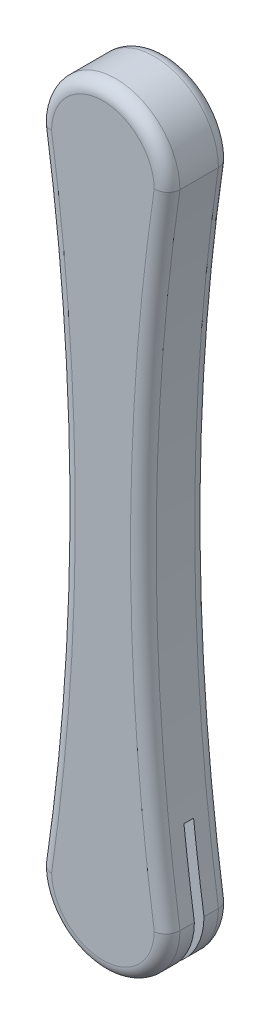
ISO-10303-21;
HEADER;
FILE_DESCRIPTION(('STEP AP214'),'2;1');
FILE_NAME('part.step','',(''),(''),'','','');
FILE_SCHEMA(('AUTOMOTIVE_DESIGN { 1 0 10303 214 1 1 1 1 }'));
ENDSEC;
DATA;
#1=APPLICATION_CONTEXT('core data for automotive mechanical design processes');
#2=APPLICATION_PROTOCOL_DEFINITION('international standard','automotive_design',2000,#1);
#3=PRODUCT_CONTEXT('',#1,'mechanical');
#4=PRODUCT('Part','Part','',(#3));
#5=PRODUCT_RELATED_PRODUCT_CATEGORY('part','',(#4));
#6=PRODUCT_DEFINITION_FORMATION('','',#4);
#7=PRODUCT_DEFINITION_CONTEXT('part definition',#1,'design');
#8=PRODUCT_DEFINITION('design','',#6,#7);
#9=PRODUCT_DEFINITION_SHAPE('','',#8);
#10=(LENGTH_UNIT() NAMED_UNIT(*) SI_UNIT(.MILLI.,.METRE.));
#11=(NAMED_UNIT(*) PLANE_ANGLE_UNIT() SI_UNIT($,.RADIAN.));
#12=(NAMED_UNIT(*) SI_UNIT($,.STERADIAN.) SOLID_ANGLE_UNIT());
#13=UNCERTAINTY_MEASURE_WITH_UNIT(LENGTH_MEASURE(1.E-05),#10,'distance_accuracy_value','');
#14=(GEOMETRIC_REPRESENTATION_CONTEXT(3) GLOBAL_UNCERTAINTY_ASSIGNED_CONTEXT((#13)) GLOBAL_UNIT_ASSIGNED_CONTEXT((#10,
#11,#12)) REPRESENTATION_CONTEXT('',''));
#15=CARTESIAN_POINT('',(0.,0.,0.));
#16=DIRECTION('',(0.,0.,1.));
#17=DIRECTION('',(1.,0.,0.));
#18=AXIS2_PLACEMENT_3D('',#15,#16,#17);
#19=CARTESIAN_POINT('',(0.,-200.,20.));
#20=DIRECTION('',(0.,0.,-1.));
#21=DIRECTION('',(-1.,0.,0.));
#22=AXIS2_PLACEMENT_3D('',#19,#20,#21);
#23=CYLINDRICAL_SURFACE('',#22,20.);
#24=DIRECTION('',(0.,0.,-1.));
#25=VECTOR('',#24,1.);
#26=CARTESIAN_POINT('',(-19.9984345020432,-200.250234824694,20.));
#27=LINE('',#26,#25);
#28=CARTESIAN_POINT('',(-19.9984345020432,-200.250234824694,16.));
#29=VERTEX_POINT('',#28);
#30=CARTESIAN_POINT('',(-19.9984345020431,-200.250234824694,11.5));
#31=VERTEX_POINT('',#30);
#32=EDGE_CURVE('E163',#29,#31,#27,.T.);
#33=ORIENTED_EDGE('',*,*,#32,.T.);
#34=CARTESIAN_POINT('',(0.,-200.,11.5));
#35=DIRECTION('',(0.,0.,1.));
#36=DIRECTION('',(1.,0.,0.));
#37=AXIS2_PLACEMENT_3D('',#34,#35,#36);
#38=CIRCLE('',#37,20.);
#39=CARTESIAN_POINT('',(20.,-200.,11.5));
#40=VERTEX_POINT('',#39);
#41=EDGE_CURVE('E49',#31,#40,#38,.T.);
#42=ORIENTED_EDGE('',*,*,#41,.T.);
#43=DIRECTION('',(0.,0.,-1.));
#44=VECTOR('',#43,1.);
#45=CARTESIAN_POINT('',(20.,-200.,20.));
#46=LINE('',#45,#44);
#47=CARTESIAN_POINT('',(20.,-200.,16.));
#48=VERTEX_POINT('',#47);
#49=EDGE_CURVE('E159',#48,#40,#46,.T.);
#50=ORIENTED_EDGE('',*,*,#49,.F.);
#51=CARTESIAN_POINT('',(0.,-200.,16.));
#52=DIRECTION('',(0.,0.,-1.));
#53=DIRECTION('',(-1.,0.,0.));
#54=AXIS2_PLACEMENT_3D('',#51,#52,#53);
#55=CIRCLE('',#54,20.);
#56=EDGE_CURVE('E187',#48,#29,#55,.T.);
#57=ORIENTED_EDGE('',*,*,#56,.T.);
#58=EDGE_LOOP('',(#33,#42,#50,#57));
#59=FACE_BOUND('',#58,.T.);
#60=ADVANCED_FACE('F39',(#59),#23,.T.);
#61=CARTESIAN_POINT('',(692.606868832009,-99.9999999999999,20.));
#62=DIRECTION('',(0.,0.,-1.));
#63=DIRECTION('',(-1.,0.,0.));
#64=AXIS2_PLACEMENT_3D('',#61,#62,#63);
#65=CYLINDRICAL_SURFACE('',#64,680.);
#66=ORIENTED_EDGE('',*,*,#49,.T.);
#67=CARTESIAN_POINT('',(692.606868832009,-99.9999999999999,11.5));
#68=DIRECTION('',(0.,0.,1.));
#69=DIRECTION('',(1.,0.,0.));
#70=AXIS2_PLACEMENT_3D('',#67,#68,#69);
#71=CIRCLE('',#70,680.);
#72=CARTESIAN_POINT('',(16.7555538225615,-175.,11.5));
#73=VERTEX_POINT('',#72);
#74=EDGE_CURVE('E154',#40,#73,#71,.F.);
#75=ORIENTED_EDGE('',*,*,#74,.T.);
#76=DIRECTION('',(0.,0.,-1.));
#77=VECTOR('',#76,1.);
#78=CARTESIAN_POINT('',(16.7555538225616,-175.,20.));
#79=LINE('',#78,#77);
#80=CARTESIAN_POINT('',(16.7555538225616,-175.,8.5));
#81=VERTEX_POINT('',#80);
#82=EDGE_CURVE('E157',#73,#81,#79,.T.);
#83=ORIENTED_EDGE('',*,*,#82,.T.);
#84=CARTESIAN_POINT('',(692.606868832009,-99.9999999999999,8.5));
#85=DIRECTION('',(0.,0.,-1.));
#86=DIRECTION('',(0.,1.,0.));
#87=AXIS2_PLACEMENT_3D('',#84,#85,#86);
#88=CIRCLE('',#87,680.);
#89=CARTESIAN_POINT('',(20.,-200.,8.5));
#90=VERTEX_POINT('',#89);
#91=EDGE_CURVE('E142',#81,#90,#88,.F.);
#92=ORIENTED_EDGE('',*,*,#91,.T.);
#93=CARTESIAN_POINT('',(20.,-200.,4.));
#94=VERTEX_POINT('',#93);
#95=EDGE_CURVE('E162',#90,#94,#46,.T.);
#96=ORIENTED_EDGE('',*,*,#95,.T.);
#97=CARTESIAN_POINT('',(692.606868832009,-99.9999999999999,4.));
#98=DIRECTION('',(0.,0.,-1.));
#99=DIRECTION('',(-1.,0.,0.));
#100=AXIS2_PLACEMENT_3D('',#97,#98,#99);
#101=CIRCLE('',#100,680.);
#102=CARTESIAN_POINT('',(20.,0.,4.));
#103=VERTEX_POINT('',#102);
#104=EDGE_CURVE('E198',#94,#103,#101,.T.);
#105=ORIENTED_EDGE('',*,*,#104,.T.);
#106=DIRECTION('',(0.,0.,-1.));
#107=VECTOR('',#106,1.);
#108=CARTESIAN_POINT('',(20.,0.,20.));
#109=LINE('',#108,#107);
#110=CARTESIAN_POINT('',(20.,0.,16.));
#111=VERTEX_POINT('',#110);
#112=EDGE_CURVE('E169',#111,#103,#109,.T.);
#113=ORIENTED_EDGE('',*,*,#112,.F.);
#114=CARTESIAN_POINT('',(692.606868832009,-99.9999999999999,16.));
#115=DIRECTION('',(0.,0.,-1.));
#116=DIRECTION('',(-1.,0.,0.));
#117=AXIS2_PLACEMENT_3D('',#114,#115,#116);
#118=CIRCLE('',#117,680.);
#119=EDGE_CURVE('E196',#111,#48,#118,.F.);
#120=ORIENTED_EDGE('',*,*,#119,.T.);
#121=EDGE_LOOP('',(#66,#75,#83,#92,#96,#105,#113,#120));
#122=FACE_BOUND('',#121,.T.);
#123=ADVANCED_FACE('F298',(#122),#65,.F.);
#124=CARTESIAN_POINT('',(0.,0.,20.));
#125=DIRECTION('',(0.,0.,-1.));
#126=DIRECTION('',(-1.,0.,0.));
#127=AXIS2_PLACEMENT_3D('',#124,#125,#126);
#128=CYLINDRICAL_SURFACE('',#127,20.);
#129=ORIENTED_EDGE('',*,*,#112,.T.);
#130=CARTESIAN_POINT('',(0.,0.,4.));
#131=DIRECTION('',(0.,0.,-1.));
#132=DIRECTION('',(-1.,0.,0.));
#133=AXIS2_PLACEMENT_3D('',#130,#131,#132);
#134=CIRCLE('',#133,20.);
#135=CARTESIAN_POINT('',(-19.9984345020432,-0.250234824693501,4.));
#136=VERTEX_POINT('',#135);
#137=EDGE_CURVE('E175',#103,#136,#134,.F.);
#138=ORIENTED_EDGE('',*,*,#137,.T.);
#139=DIRECTION('',(0.,0.,-1.));
#140=VECTOR('',#139,1.);
#141=CARTESIAN_POINT('',(-19.9984345020432,-0.250234824693501,20.));
#142=LINE('',#141,#140);
#143=CARTESIAN_POINT('',(-19.9984345020432,-0.250234824693501,16.));
#144=VERTEX_POINT('',#143);
#145=EDGE_CURVE('E166',#144,#136,#142,.T.);
#146=ORIENTED_EDGE('',*,*,#145,.F.);
#147=CARTESIAN_POINT('',(0.,0.,16.));
#148=DIRECTION('',(0.,0.,-1.));
#149=DIRECTION('',(-1.,0.,0.));
#150=AXIS2_PLACEMENT_3D('',#147,#148,#149);
#151=CIRCLE('',#150,20.);
#152=EDGE_CURVE('E172',#144,#111,#151,.T.);
#153=ORIENTED_EDGE('',*,*,#152,.T.);
#154=EDGE_LOOP('',(#129,#138,#146,#153));
#155=FACE_BOUND('',#154,.T.);
#156=ADVANCED_FACE('F307',(#155),#128,.T.);
#157=CARTESIAN_POINT('',(-692.605303334053,-100.250234824694,20.));
#158=DIRECTION('',(0.,0.,-1.));
#159=DIRECTION('',(-1.,0.,0.));
#160=AXIS2_PLACEMENT_3D('',#157,#158,#159);
#161=CYLINDRICAL_SURFACE('',#160,680.);
#162=DIRECTION('',(0.,0.,-1.));
#163=VECTOR('',#162,1.);
#164=CARTESIAN_POINT('',(-16.7262663709016,-175.,20.));
#165=LINE('',#164,#163);
#166=CARTESIAN_POINT('',(-16.7262663709016,-175.,8.5));
#167=VERTEX_POINT('',#166);
#168=CARTESIAN_POINT('',(-16.7262663709016,-175.,11.5));
#169=VERTEX_POINT('',#168);
#170=EDGE_CURVE('E11',#167,#169,#165,.F.);
#171=ORIENTED_EDGE('',*,*,#170,.T.);
#172=CARTESIAN_POINT('',(-692.605303334053,-100.250234824694,11.5));
#173=DIRECTION('',(0.,0.,1.));
#174=DIRECTION('',(1.,0.,0.));
#175=AXIS2_PLACEMENT_3D('',#172,#173,#174);
#176=CIRCLE('',#175,680.);
#177=EDGE_CURVE('E149',#169,#31,#176,.F.);
#178=ORIENTED_EDGE('',*,*,#177,.T.);
#179=ORIENTED_EDGE('',*,*,#32,.F.);
#180=CARTESIAN_POINT('',(-692.605303334053,-100.250234824694,16.));
#181=DIRECTION('',(0.,0.,-1.));
#182=DIRECTION('',(-1.,0.,0.));
#183=AXIS2_PLACEMENT_3D('',#180,#181,#182);
#184=CIRCLE('',#183,680.);
#185=EDGE_CURVE('E192',#29,#144,#184,.F.);
#186=ORIENTED_EDGE('',*,*,#185,.T.);
#187=ORIENTED_EDGE('',*,*,#145,.T.);
#188=CARTESIAN_POINT('',(-692.605303334053,-100.250234824694,4.));
#189=DIRECTION('',(0.,0.,-1.));
#190=DIRECTION('',(-1.,0.,0.));
#191=AXIS2_PLACEMENT_3D('',#188,#189,#190);
#192=CIRCLE('',#191,680.);
#193=CARTESIAN_POINT('',(-19.9984345020432,-200.250234824694,4.));
#194=VERTEX_POINT('',#193);
#195=EDGE_CURVE('E194',#136,#194,#192,.T.);
#196=ORIENTED_EDGE('',*,*,#195,.T.);
#197=CARTESIAN_POINT('',(-19.9984345020432,-200.250234824694,8.5));
#198=VERTEX_POINT('',#197);
#199=EDGE_CURVE('E147',#198,#194,#27,.T.);
#200=ORIENTED_EDGE('',*,*,#199,.F.);
#201=CARTESIAN_POINT('',(-692.605303334053,-100.250234824694,8.5));
#202=DIRECTION('',(0.,0.,-1.));
#203=DIRECTION('',(0.,1.,0.));
#204=AXIS2_PLACEMENT_3D('',#201,#202,#203);
#205=CIRCLE('',#204,680.);
#206=EDGE_CURVE('E56',#198,#167,#205,.F.);
#207=ORIENTED_EDGE('',*,*,#206,.T.);
#208=EDGE_LOOP('',(#171,#178,#179,#186,#187,#196,#200,#207));
#209=FACE_BOUND('',#208,.T.);
#210=ADVANCED_FACE('F145',(#209),#161,.F.);
#211=ORIENTED_EDGE('',*,*,#95,.F.);
#212=CARTESIAN_POINT('',(0.,-200.,8.5));
#213=DIRECTION('',(0.,0.,-1.));
#214=DIRECTION('',(0.,1.,0.));
#215=AXIS2_PLACEMENT_3D('',#212,#213,#214);
#216=CIRCLE('',#215,20.);
#217=EDGE_CURVE('E209',#90,#198,#216,.T.);
#218=ORIENTED_EDGE('',*,*,#217,.T.);
#219=ORIENTED_EDGE('',*,*,#199,.T.);
#220=CARTESIAN_POINT('',(0.,-200.,4.));
#221=DIRECTION('',(0.,0.,-1.));
#222=DIRECTION('',(-1.,0.,0.));
#223=AXIS2_PLACEMENT_3D('',#220,#221,#222);
#224=CIRCLE('',#223,20.);
#225=EDGE_CURVE('E189',#194,#94,#224,.F.);
#226=ORIENTED_EDGE('',*,*,#225,.T.);
#227=EDGE_LOOP('',(#211,#218,#219,#226));
#228=FACE_BOUND('',#227,.T.);
#229=ADVANCED_FACE('F328',(#228),#23,.T.);
#230=CARTESIAN_POINT('',(346.303434416005,-50.,20.));
#231=DIRECTION('',(0.,0.,-1.));
#232=DIRECTION('',(-1.,0.,0.));
#233=AXIS2_PLACEMENT_3D('',#230,#231,#232);
#234=PLANE('',#233);
#235=CARTESIAN_POINT('',(692.606868832009,-99.9999999999999,20.));
#236=DIRECTION('',(0.,0.,-1.));
#237=DIRECTION('',(-1.,0.,0.));
#238=AXIS2_PLACEMENT_3D('',#235,#236,#237);
#239=CIRCLE('',#238,684.);
#240=CARTESIAN_POINT('',(15.99756921162,-200.278889439433,20.));
#241=VERTEX_POINT('',#240);
#242=CARTESIAN_POINT('',(15.99756921162,0.278889439433064,20.));
#243=VERTEX_POINT('',#242);
#244=EDGE_CURVE('E200',#241,#243,#239,.T.);
#245=ORIENTED_EDGE('',*,*,#244,.T.);
#246=CARTESIAN_POINT('',(0.,0.,20.));
#247=DIRECTION('',(0.,0.,-1.));
#248=DIRECTION('',(-1.,0.,0.));
#249=AXIS2_PLACEMENT_3D('',#246,#247,#248);
#250=CIRCLE('',#249,16.);
#251=CARTESIAN_POINT('',(-15.9999055447227,0.0549778132475673,20.));
#252=VERTEX_POINT('',#251);
#253=EDGE_CURVE('E206',#243,#252,#250,.F.);
#254=ORIENTED_EDGE('',*,*,#253,.T.);
#255=CARTESIAN_POINT('',(-692.605303334053,-100.250234824694,20.));
#256=DIRECTION('',(0.,0.,-1.));
#257=DIRECTION('',(-1.,0.,0.));
#258=AXIS2_PLACEMENT_3D('',#255,#256,#257);
#259=CIRCLE('',#258,684.);
#260=CARTESIAN_POINT('',(-15.9920986731792,-200.502772341422,20.));
#261=VERTEX_POINT('',#260);
#262=EDGE_CURVE('E204',#252,#261,#259,.T.);
#263=ORIENTED_EDGE('',*,*,#262,.T.);
#264=CARTESIAN_POINT('',(0.,-200.,20.));
#265=DIRECTION('',(0.,0.,-1.));
#266=DIRECTION('',(-1.,0.,0.));
#267=AXIS2_PLACEMENT_3D('',#264,#265,#266);
#268=CIRCLE('',#267,16.);
#269=EDGE_CURVE('E202',#261,#241,#268,.F.);
#270=ORIENTED_EDGE('',*,*,#269,.T.);
#271=EDGE_LOOP('',(#245,#254,#263,#270));
#272=FACE_BOUND('',#271,.T.);
#273=ADVANCED_FACE('F313',(#272),#234,.F.);
#274=CARTESIAN_POINT('',(346.303434416005,-50.,0.));
#275=DIRECTION('',(0.,0.,-1.));
#276=DIRECTION('',(-1.,0.,0.));
#277=AXIS2_PLACEMENT_3D('',#274,#275,#276);
#278=PLANE('',#277);
#279=CARTESIAN_POINT('',(0.,0.,0.));
#280=DIRECTION('',(0.,0.,-1.));
#281=DIRECTION('',(-1.,0.,0.));
#282=AXIS2_PLACEMENT_3D('',#279,#280,#281);
#283=CIRCLE('',#282,6.);
#284=CARTESIAN_POINT('',(6.,0.,0.));
#285=VERTEX_POINT('',#284);
#286=EDGE_CURVE('E44',#285,#285,#283,.F.);
#287=ORIENTED_EDGE('',*,*,#286,.T.);
#288=EDGE_LOOP('',(#287));
#289=FACE_BOUND('',#288,.T.);
#290=CARTESIAN_POINT('',(0.,-200.,0.));
#291=DIRECTION('',(0.,0.,-1.));
#292=DIRECTION('',(-1.,0.,0.));
#293=AXIS2_PLACEMENT_3D('',#290,#291,#292);
#294=CIRCLE('',#293,16.);
#295=CARTESIAN_POINT('',(15.99756921162,-200.278889439433,0.));
#296=VERTEX_POINT('',#295);
#297=CARTESIAN_POINT('',(-15.9920986731792,-200.502772341422,0.));
#298=VERTEX_POINT('',#297);
#299=EDGE_CURVE('E180',#296,#298,#294,.T.);
#300=ORIENTED_EDGE('',*,*,#299,.T.);
#301=CARTESIAN_POINT('',(-692.605303334053,-100.250234824694,0.));
#302=DIRECTION('',(0.,0.,-1.));
#303=DIRECTION('',(-1.,0.,0.));
#304=AXIS2_PLACEMENT_3D('',#301,#302,#303);
#305=CIRCLE('',#304,684.);
#306=CARTESIAN_POINT('',(-15.9999055447228,0.054977813247551,0.));
#307=VERTEX_POINT('',#306);
#308=EDGE_CURVE('E185',#298,#307,#305,.F.);
#309=ORIENTED_EDGE('',*,*,#308,.T.);
#310=CARTESIAN_POINT('',(0.,0.,0.));
#311=DIRECTION('',(0.,0.,-1.));
#312=DIRECTION('',(-1.,0.,0.));
#313=AXIS2_PLACEMENT_3D('',#310,#311,#312);
#314=CIRCLE('',#313,16.);
#315=CARTESIAN_POINT('',(15.99756921162,0.278889439433064,0.));
#316=VERTEX_POINT('',#315);
#317=EDGE_CURVE('E182',#307,#316,#314,.T.);
#318=ORIENTED_EDGE('',*,*,#317,.T.);
#319=CARTESIAN_POINT('',(692.606868832009,-99.9999999999999,0.));
#320=DIRECTION('',(0.,0.,-1.));
#321=DIRECTION('',(-1.,0.,0.));
#322=AXIS2_PLACEMENT_3D('',#319,#320,#321);
#323=CIRCLE('',#322,684.);
#324=EDGE_CURVE('E178',#316,#296,#323,.F.);
#325=ORIENTED_EDGE('',*,*,#324,.T.);
#326=EDGE_LOOP('',(#300,#309,#318,#325));
#327=FACE_BOUND('',#326,.T.);
#328=ADVANCED_FACE('F341',(#289,#327),#278,.T.);
#329=CARTESIAN_POINT('',(0.,-200.,4.));
#330=DIRECTION('',(0.,0.,-1.));
#331=DIRECTION('',(-1.,0.,0.));
#332=AXIS2_PLACEMENT_3D('',#329,#330,#331);
#333=TOROIDAL_SURFACE('',#332,16.,4.);
#334=CARTESIAN_POINT('',(-19.9984345020432,-200.250234824694,4.));
#335=CARTESIAN_POINT('',(-19.9984454394821,-200.250233791225,3.88776679481851));
#336=CARTESIAN_POINT('',(-19.9937065696373,-200.250554631599,3.77553880193896));
#337=CARTESIAN_POINT('',(-19.9748138238556,-200.251832212198,3.5518875728501));
#338=CARTESIAN_POINT('',(-19.9606604532676,-200.252788918291,3.44046429377008));
#339=CARTESIAN_POINT('',(-19.9230378928233,-200.255329398508,3.21929040919997));
#340=CARTESIAN_POINT('',(-19.8995759366159,-200.256912685718,3.10953857344597));
#341=CARTESIAN_POINT('',(-19.8435291947423,-200.260689082363,2.89243318359138));
#342=CARTESIAN_POINT('',(-19.810944510185,-200.26288218504,2.78507960292475));
#343=CARTESIAN_POINT('',(-19.6997772596469,-200.270349987562,2.46765856862276));
#344=CARTESIAN_POINT('',(-19.6077647749169,-200.276514319832,2.26213307582174));
#345=CARTESIAN_POINT('',(-19.3907210964591,-200.290967199231,1.86961272486903));
#346=CARTESIAN_POINT('',(-19.2656967496246,-200.299255305863,1.68261403517512));
#347=CARTESIAN_POINT('',(-18.9859798306666,-200.317654104664,1.33197530290884));
#348=CARTESIAN_POINT('',(-18.8312493017367,-200.3277671276,1.16836561712754));
#349=CARTESIAN_POINT('',(-18.4965856089464,-200.349432255508,0.86936245123809));
#350=CARTESIAN_POINT('',(-18.3166445293082,-200.360984812348,0.733977866784122));
#351=CARTESIAN_POINT('',(-17.9361006896521,-200.385142032344,0.494847888397598));
#352=CARTESIAN_POINT('',(-17.7354320248407,-200.397750025647,0.391207845015093));
#353=CARTESIAN_POINT('',(-17.3196553173584,-200.423533687897,0.219098453641083));
#354=CARTESIAN_POINT('',(-17.1045579238845,-200.436708935663,0.150603482670942));
#355=CARTESIAN_POINT('',(-16.7437673913138,-200.458486523699,0.0682643311462777));
#356=CARTESIAN_POINT('',(-16.6004218026529,-200.467058811811,0.0436601635987266));
#357=CARTESIAN_POINT('',(-16.3120529477376,-200.484130512513,0.0101380670076635));
#358=CARTESIAN_POINT('',(-16.1670328771673,-200.492630022778,0.00119405264250792));
#359=CARTESIAN_POINT('',(-16.0120759655208,-200.501615243197,3.71543275995216E-05));
#360=CARTESIAN_POINT('',(-16.0020870301448,-200.502194024837,-9.63783577593067E-08));
#361=CARTESIAN_POINT('',(-15.9920986731792,-200.502772341422,0.));
#362=B_SPLINE_CURVE_WITH_KNOTS('',3,(#334,#335,#336,#337,#338,#339,#340,#341,#342,#343,#344,
#345,#346,#347,#348,#349,#350,#351,#352,#353,#354,#355,#356,#357,#358,#359,#360,#361),
.UNSPECIFIED.,.F.,.F.,(4,2,2,2,2,2,2,2,2,2,2,2,2,4),(0.,0.33658977386078,0.67316148181137,
1.00947215248012,1.34577909590584,2.01809921070953,2.69027999095841,3.36332543008833,
4.03658267212603,4.71205062958212,5.38702542597595,5.82337295547411,6.25899296125294,
6.28900990652432),.UNSPECIFIED.);
#363=EDGE_CURVE('E251',#298,#194,#362,.F.);
#364=ORIENTED_EDGE('',*,*,#363,.F.);
#365=ORIENTED_EDGE('',*,*,#299,.F.);
#366=CARTESIAN_POINT('',(20.,-200.,4.));
#367=CARTESIAN_POINT('',(20.0000109019128,-199.999998923036,3.88772633927062));
#368=CARTESIAN_POINT('',(19.9952730315635,-200.00034946274,3.77545787591763));
#369=CARTESIAN_POINT('',(19.9763840866229,-200.001745579381,3.55172571739533));
#370=CARTESIAN_POINT('',(19.9622335090399,-200.002791119621,3.4402619800491));
#371=CARTESIAN_POINT('',(19.9246178237915,-200.005567983463,3.21900603447089));
#372=CARTESIAN_POINT('',(19.9011598286707,-200.007298783401,3.10921261618391));
#373=CARTESIAN_POINT('',(19.845121822106,-200.011428065279,2.89202470696538));
#374=CARTESIAN_POINT('',(19.8125419132648,-200.013826539708,2.78463018906583));
#375=CARTESIAN_POINT('',(19.7013889933213,-200.02199624108,2.46708688975453));
#376=CARTESIAN_POINT('',(19.6093862424732,-200.028742975606,2.26148158279054));
#377=CARTESIAN_POINT('',(19.3923573148618,-200.044577009925,1.868812738786));
#378=CARTESIAN_POINT('',(19.267338112282,-200.053663815407,1.68174529738873));
#379=CARTESIAN_POINT('',(18.9876496169439,-200.073859387338,1.3310240607902));
#380=CARTESIAN_POINT('',(18.8329482327657,-200.08497034157,1.16739594495069));
#381=CARTESIAN_POINT('',(18.4983395842418,-200.108810474718,0.868376750774389));
#382=CARTESIAN_POINT('',(18.3184243857682,-200.12154016289,0.732994594205198));
#383=CARTESIAN_POINT('',(17.9380157363658,-200.148202276006,0.493957707872863));
#384=CARTESIAN_POINT('',(17.7374655217148,-200.162138000905,0.390393798147803));
#385=CARTESIAN_POINT('',(17.3219391529977,-200.190698725489,0.218450911548055));
#386=CARTESIAN_POINT('',(17.1069738330407,-200.205323205112,0.150045837729155));
#387=CARTESIAN_POINT('',(16.74699190079,-200.229517217978,0.0680031291274298));
#388=CARTESIAN_POINT('',(16.6043320034374,-200.239031922183,0.0435366082040891));
#389=CARTESIAN_POINT('',(16.3173480833591,-200.258013953601,0.0101701837058838));
#390=CARTESIAN_POINT('',(16.1730272150863,-200.267481333233,0.00124451499942648));
#391=CARTESIAN_POINT('',(16.0183591722993,-200.277538834193,4.03220836615943E-05));
#392=CARTESIAN_POINT('',(16.0079638800112,-200.278214372824,-1.0465857164122E-07));
#393=CARTESIAN_POINT('',(15.99756921162,-200.278889439433,0.));
#394=B_SPLINE_CURVE_WITH_KNOTS('',3,(#366,#367,#368,#369,#370,#371,#372,#373,#374,#375,#376,
#377,#378,#379,#380,#381,#382,#383,#384,#385,#386,#387,#388,#389,#390,#391,#392,#393),
.UNSPECIFIED.,.F.,.F.,(4,2,2,2,2,2,2,2,2,2,2,2,2,4),(0.,0.336711152766807,0.673404527975526,
1.00984110278291,1.34627389352537,2.01884861039006,2.69128137036514,3.36444528198193,
4.03782149830206,4.71310227424822,5.38788109082009,5.82232007696649,6.25603811976697,
6.28728963868782),.UNSPECIFIED.);
#395=EDGE_CURVE('E244',#94,#296,#394,.T.);
#396=ORIENTED_EDGE('',*,*,#395,.F.);
#397=ORIENTED_EDGE('',*,*,#225,.F.);
#398=EDGE_LOOP('',(#364,#365,#396,#397));
#399=FACE_BOUND('',#398,.T.);
#400=ADVANCED_FACE('F238',(#399),#333,.T.);
#401=CARTESIAN_POINT('',(692.606868832009,-99.9999999999999,4.));
#402=DIRECTION('',(0.,0.,-1.));
#403=DIRECTION('',(-1.,0.,0.));
#404=AXIS2_PLACEMENT_3D('',#401,#402,#403);
#405=TOROIDAL_SURFACE('',#404,684.,4.);
#406=ORIENTED_EDGE('',*,*,#395,.T.);
#407=ORIENTED_EDGE('',*,*,#324,.F.);
#408=CARTESIAN_POINT('',(20.,0.,4.));
#409=CARTESIAN_POINT('',(20.0000109019128,-1.07696458338639E-06,3.88772633927061));
#410=CARTESIAN_POINT('',(19.9952730315635,0.000349462739565054,3.77545787591763));
#411=CARTESIAN_POINT('',(19.9763840866229,0.00174557938126449,3.55172571739533));
#412=CARTESIAN_POINT('',(19.9622335090399,0.00279111962150472,3.44026198004911));
#413=CARTESIAN_POINT('',(19.9246178237915,0.0055679834636016,3.2190060344709));
#414=CARTESIAN_POINT('',(19.9011598286706,0.00729878340137629,3.10921261618392));
#415=CARTESIAN_POINT('',(19.845121822106,0.0114280652788351,2.89202470696538));
#416=CARTESIAN_POINT('',(19.8125419132648,0.0138265397085577,2.78463018906583));
#417=CARTESIAN_POINT('',(19.7013889933213,0.0219962410793922,2.46708688975451));
#418=CARTESIAN_POINT('',(19.6093862424731,0.0287429756053602,2.26148158279051));
#419=CARTESIAN_POINT('',(19.3923573148617,0.0445770099243005,1.86881273878597));
#420=CARTESIAN_POINT('',(19.2673381122819,0.0536638154056324,1.68174529738871));
#421=CARTESIAN_POINT('',(18.9876496169439,0.0738593873376589,1.33102406079019));
#422=CARTESIAN_POINT('',(18.8329482327657,0.0849703415700579,1.16739594495069));
#423=CARTESIAN_POINT('',(18.4983395842417,0.108810474717688,0.868376750774379));
#424=CARTESIAN_POINT('',(18.3184243857682,0.121540162888904,0.732994594205164));
#425=CARTESIAN_POINT('',(17.9380157363657,0.148202276004551,0.493957707872821));
#426=CARTESIAN_POINT('',(17.7374655217147,0.162138000904458,0.390393798147777));
#427=CARTESIAN_POINT('',(17.3219391529977,0.190698725489188,0.21845091154805));
#428=CARTESIAN_POINT('',(17.1069738330407,0.205323205112282,0.150045837729158));
#429=CARTESIAN_POINT('',(16.74699190079,0.229517217978667,0.0680031291274328));
#430=CARTESIAN_POINT('',(16.6043320034374,0.239031922183252,0.0435366082040895));
#431=CARTESIAN_POINT('',(16.3173480833591,0.258013953599984,0.010170183705881));
#432=CARTESIAN_POINT('',(16.1730272150862,0.267481333231027,0.00124451499942355));
#433=CARTESIAN_POINT('',(16.0183591722993,0.277538834192624,4.03220836611975E-05));
#434=CARTESIAN_POINT('',(16.0079638800112,0.278214372823555,-1.04658571853578E-07));
#435=CARTESIAN_POINT('',(15.99756921162,0.278889439433064,0.));
#436=B_SPLINE_CURVE_WITH_KNOTS('',3,(#408,#409,#410,#411,#412,#413,#414,#415,#416,#417,#418,
#419,#420,#421,#422,#423,#424,#425,#426,#427,#428,#429,#430,#431,#432,#433,#434,#435),
.UNSPECIFIED.,.F.,.F.,(4,2,2,2,2,2,2,2,2,2,2,2,2,4),(0.,0.336711152766805,0.673404527975525,
1.00984110278291,1.34627389352537,2.01884861039006,2.69128137036514,3.36444528198194,
4.03782149830208,4.71310227424825,5.38788109082013,5.82232007696651,6.25603811976699,
6.28728963868784),.UNSPECIFIED.);
#437=EDGE_CURVE('E218',#103,#316,#436,.T.);
#438=ORIENTED_EDGE('',*,*,#437,.F.);
#439=ORIENTED_EDGE('',*,*,#104,.F.);
#440=EDGE_LOOP('',(#406,#407,#438,#439));
#441=FACE_BOUND('',#440,.T.);
#442=ADVANCED_FACE('F233',(#441),#405,.T.);
#443=CARTESIAN_POINT('',(-692.605303334053,-100.250234824694,4.));
#444=DIRECTION('',(0.,0.,-1.));
#445=DIRECTION('',(-1.,0.,0.));
#446=AXIS2_PLACEMENT_3D('',#443,#444,#445);
#447=TOROIDAL_SURFACE('',#446,684.,4.);
#448=ORIENTED_EDGE('',*,*,#363,.T.);
#449=ORIENTED_EDGE('',*,*,#195,.F.);
#450=CARTESIAN_POINT('',(-19.9984345020432,-0.250234824693501,4.));
#451=CARTESIAN_POINT('',(-19.9984453707826,-0.25023594490625,3.88768916575568));
#452=CARTESIAN_POINT('',(-19.9937087749499,-0.249855712993675,3.77538351517465));
#453=CARTESIAN_POINT('',(-19.9748247437589,-0.248341087425303,3.55157699283923));
#454=CARTESIAN_POINT('',(-19.9606777977122,-0.247206732981755,3.44007607954547));
#455=CARTESIAN_POINT('',(-19.9230712634424,-0.244193534881812,3.21874472665988));
#456=CARTESIAN_POINT('',(-19.899618675729,-0.242315250875601,3.10891309563233));
#457=CARTESIAN_POINT('',(-19.8435929240125,-0.237833147034006,2.89164935485122));
#458=CARTESIAN_POINT('',(-19.811019863976,-0.235229335469108,2.78421721776024));
#459=CARTESIAN_POINT('',(-19.6998885193501,-0.226357839322489,2.46656156111172));
#460=CARTESIAN_POINT('',(-19.6079016868816,-0.219028773303235,2.26088290827148));
#461=CARTESIAN_POINT('',(-19.3909028506115,-0.201813685026309,1.86807762422033));
#462=CARTESIAN_POINT('',(-19.2658979389881,-0.191928211886278,1.68094702080444));
#463=CARTESIAN_POINT('',(-18.9862571219629,-0.169936019790242,1.33015008377719));
#464=CARTESIAN_POINT('',(-18.8315945264,-0.157827300464587,1.16650511956669));
#465=CARTESIAN_POINT('',(-18.4970625941227,-0.131812436948998,0.867471349589345));
#466=CARTESIAN_POINT('',(-18.3171853021628,-0.117905725599925,0.732091495162581));
#467=CARTESIAN_POINT('',(-17.9369309283071,-0.0887394615550578,0.493140284213629));
#468=CARTESIAN_POINT('',(-17.7365054792976,-0.0734767288008143,0.389646384648988));
#469=CARTESIAN_POINT('',(-17.3212426112165,-0.0421405032043768,0.217856689266427));
#470=CARTESIAN_POINT('',(-17.1064162078832,-0.0260676323451925,0.149534329167059));
#471=CARTESIAN_POINT('',(-16.7472498610044,0.000533684393048559,0.0677735970422413));
#472=CARTESIAN_POINT('',(-16.6052756331091,0.0109822856833163,0.0434384918958193));
#473=CARTESIAN_POINT('',(-16.3196762537775,0.0318572185878356,0.0102156411061255));
#474=CARTESIAN_POINT('',(-16.1760542155647,0.0422835584853094,0.00130245417928191));
#475=CARTESIAN_POINT('',(-16.0216190002059,0.0534141517611763,4.40751360957274E-05));
#476=CARTESIAN_POINT('',(-16.0107619333988,0.054196222658561,-1.14483847516361E-07));
#477=CARTESIAN_POINT('',(-15.9999055447228,0.0549778132481822,0.));
#478=B_SPLINE_CURVE_WITH_KNOTS('',3,(#450,#451,#452,#453,#454,#455,#456,#457,#458,#459,#460,
#461,#462,#463,#464,#465,#466,#467,#468,#469,#470,#471,#472,#473,#474,#475,#476,#477),
.UNSPECIFIED.,.F.,.F.,(4,2,2,2,2,2,2,2,2,2,2,2,2,4),(0.,0.33682268456174,0.673627856661422,
1.01018013366076,1.346728574366,2.01953727336362,2.69220157255397,3.36547409520781,
4.03895951568243,4.71406828868032,5.38866641616709,5.82121828230922,6.25305589200492,
6.28571132789571),.UNSPECIFIED.);
#479=EDGE_CURVE('E210',#307,#136,#478,.F.);
#480=ORIENTED_EDGE('',*,*,#479,.F.);
#481=ORIENTED_EDGE('',*,*,#308,.F.);
#482=EDGE_LOOP('',(#448,#449,#480,#481));
#483=FACE_BOUND('',#482,.T.);
#484=ADVANCED_FACE('F226',(#483),#447,.T.);
#485=CARTESIAN_POINT('',(0.,0.,4.));
#486=DIRECTION('',(0.,0.,-1.));
#487=DIRECTION('',(-1.,0.,0.));
#488=AXIS2_PLACEMENT_3D('',#485,#486,#487);
#489=TOROIDAL_SURFACE('',#488,16.,4.);
#490=ORIENTED_EDGE('',*,*,#437,.T.);
#491=ORIENTED_EDGE('',*,*,#317,.F.);
#492=ORIENTED_EDGE('',*,*,#479,.T.);
#493=ORIENTED_EDGE('',*,*,#137,.F.);
#494=EDGE_LOOP('',(#490,#491,#492,#493));
#495=FACE_BOUND('',#494,.T.);
#496=ADVANCED_FACE('F229',(#495),#489,.T.);
#497=CARTESIAN_POINT('',(0.,-200.,16.));
#498=DIRECTION('',(0.,0.,-1.));
#499=DIRECTION('',(-1.,0.,0.));
#500=AXIS2_PLACEMENT_3D('',#497,#498,#499);
#501=TOROIDAL_SURFACE('',#500,16.,4.);
#502=CARTESIAN_POINT('',(-19.9984345020432,-200.250234824694,16.));
#503=CARTESIAN_POINT('',(-19.9984454394821,-200.250233791224,16.1122332051815));
#504=CARTESIAN_POINT('',(-19.9937065696373,-200.250554631598,16.224461198061));
#505=CARTESIAN_POINT('',(-19.9748138238556,-200.251832212197,16.4481124271499));
#506=CARTESIAN_POINT('',(-19.9606604532676,-200.25278891829,16.5595357062299));
#507=CARTESIAN_POINT('',(-19.9230378928233,-200.255329398508,16.7807095908));
#508=CARTESIAN_POINT('',(-19.8995759366159,-200.256912685718,16.890461426554));
#509=CARTESIAN_POINT('',(-19.8435291947423,-200.260689082363,17.1075668164086));
#510=CARTESIAN_POINT('',(-19.810944510185,-200.26288218504,17.2149203970753));
#511=CARTESIAN_POINT('',(-19.6997772596469,-200.270349987562,17.5323414313772));
#512=CARTESIAN_POINT('',(-19.6077647749169,-200.276514319832,17.7378669241783));
#513=CARTESIAN_POINT('',(-19.3907210964591,-200.29096719923,18.130387275131));
#514=CARTESIAN_POINT('',(-19.2656967496246,-200.299255305862,18.3173859648249));
#515=CARTESIAN_POINT('',(-18.9859798306666,-200.317654104664,18.6680246970912));
#516=CARTESIAN_POINT('',(-18.8312493017367,-200.3277671276,18.8316343828724));
#517=CARTESIAN_POINT('',(-18.4965856089464,-200.349432255508,19.1306375487619));
#518=CARTESIAN_POINT('',(-18.3166445293082,-200.360984812348,19.2660221332159));
#519=CARTESIAN_POINT('',(-17.9361006896521,-200.385142032344,19.5051521116024));
#520=CARTESIAN_POINT('',(-17.7354320248407,-200.397750025646,19.6087921549849));
#521=CARTESIAN_POINT('',(-17.3196553173584,-200.423533687897,19.7809015463589));
#522=CARTESIAN_POINT('',(-17.1045579238845,-200.436708935663,19.8493965173291));
#523=CARTESIAN_POINT('',(-16.7437673913138,-200.458486523698,19.9317356688537));
#524=CARTESIAN_POINT('',(-16.6004218026528,-200.467058811809,19.9563398364013));
#525=CARTESIAN_POINT('',(-16.3120529477377,-200.484130512514,19.9898619329923));
#526=CARTESIAN_POINT('',(-16.1670328771676,-200.492630022784,19.9988059473575));
#527=CARTESIAN_POINT('',(-16.0120759655208,-200.501615243197,19.9999628456724));
#528=CARTESIAN_POINT('',(-16.0020870301449,-200.502194024837,20.0000000963784));
#529=CARTESIAN_POINT('',(-15.9920986731792,-200.502772341422,20.));
#530=B_SPLINE_CURVE_WITH_KNOTS('',3,(#502,#503,#504,#505,#506,#507,#508,#509,#510,#511,#512,
#513,#514,#515,#516,#517,#518,#519,#520,#521,#522,#523,#524,#525,#526,#527,#528,#529),
.UNSPECIFIED.,.F.,.F.,(4,2,2,2,2,2,2,2,2,2,2,2,2,4),(0.,0.336589773860787,0.673161481811375,
1.00947215248013,1.34577909590585,2.01809921070954,2.69027999095842,3.36332543008834,
4.03658267212604,4.71205062958212,5.38702542597595,5.82337295547412,6.25899296125295,
6.28900990652433),.UNSPECIFIED.);
#531=EDGE_CURVE('E277',#29,#261,#530,.T.);
#532=ORIENTED_EDGE('',*,*,#531,.F.);
#533=ORIENTED_EDGE('',*,*,#56,.F.);
#534=CARTESIAN_POINT('',(20.,-200.,16.));
#535=CARTESIAN_POINT('',(20.0000109019128,-199.999998923035,16.1122736607294));
#536=CARTESIAN_POINT('',(19.9952730315635,-200.000349462739,16.2245421240824));
#537=CARTESIAN_POINT('',(19.9763840866229,-200.001745579381,16.4482742826047));
#538=CARTESIAN_POINT('',(19.9622335090399,-200.002791119621,16.5597380199509));
#539=CARTESIAN_POINT('',(19.9246178237915,-200.005567983464,16.7809939655291));
#540=CARTESIAN_POINT('',(19.9011598286707,-200.007298783401,16.8907873838161));
#541=CARTESIAN_POINT('',(19.845121822106,-200.011428065279,17.1079752930346));
#542=CARTESIAN_POINT('',(19.8125419132648,-200.013826539708,17.2153698109342));
#543=CARTESIAN_POINT('',(19.7013889933213,-200.02199624108,17.5329131102455));
#544=CARTESIAN_POINT('',(19.6093862424731,-200.028742975606,17.7385184172095));
#545=CARTESIAN_POINT('',(19.3923573148618,-200.044577009925,18.131187261214));
#546=CARTESIAN_POINT('',(19.267338112282,-200.053663815407,18.3182547026113));
#547=CARTESIAN_POINT('',(18.9876496169439,-200.073859387338,18.6689759392098));
#548=CARTESIAN_POINT('',(18.8329482327657,-200.08497034157,18.8326040550493));
#549=CARTESIAN_POINT('',(18.4983395842418,-200.108810474718,19.1316232492256));
#550=CARTESIAN_POINT('',(18.3184243857682,-200.12154016289,19.2670054057948));
#551=CARTESIAN_POINT('',(17.9380157363658,-200.148202276006,19.5060422921271));
#552=CARTESIAN_POINT('',(17.7374655217148,-200.162138000905,19.6096062018522));
#553=CARTESIAN_POINT('',(17.3219391529977,-200.190698725489,19.7815490884519));
#554=CARTESIAN_POINT('',(17.1069738330407,-200.205323205112,19.8499541622708));
#555=CARTESIAN_POINT('',(16.74699190079,-200.229517217978,19.9319968708726));
#556=CARTESIAN_POINT('',(16.6043320034374,-200.239031922183,19.9564633917959));
#557=CARTESIAN_POINT('',(16.3173480833591,-200.2580139536,19.9898298162941));
#558=CARTESIAN_POINT('',(16.1730272150863,-200.267481333232,19.9987554850006));
#559=CARTESIAN_POINT('',(16.0183591722993,-200.277538834193,19.9999596779163));
#560=CARTESIAN_POINT('',(16.0079638800112,-200.278214372824,20.0000001046586));
#561=CARTESIAN_POINT('',(15.99756921162,-200.278889439433,20.));
#562=B_SPLINE_CURVE_WITH_KNOTS('',3,(#534,#535,#536,#537,#538,#539,#540,#541,#542,#543,#544,
#545,#546,#547,#548,#549,#550,#551,#552,#553,#554,#555,#556,#557,#558,#559,#560,#561),
.UNSPECIFIED.,.F.,.F.,(4,2,2,2,2,2,2,2,2,2,2,2,2,4),(0.,0.336711152766802,0.673404527975528,
1.00984110278291,1.34627389352537,2.01884861039006,2.69128137036514,3.36444528198192,
4.03782149830205,4.71310227424822,5.38788109082009,5.82232007696648,6.25603811976697,
6.28728963868782),.UNSPECIFIED.);
#563=EDGE_CURVE('E219',#241,#48,#562,.F.);
#564=ORIENTED_EDGE('',*,*,#563,.F.);
#565=ORIENTED_EDGE('',*,*,#269,.F.);
#566=EDGE_LOOP('',(#532,#533,#564,#565));
#567=FACE_BOUND('',#566,.T.);
#568=ADVANCED_FACE('F41',(#567),#501,.T.);
#569=CARTESIAN_POINT('',(692.606868832009,-99.9999999999999,16.));
#570=DIRECTION('',(0.,0.,-1.));
#571=DIRECTION('',(-1.,0.,0.));
#572=AXIS2_PLACEMENT_3D('',#569,#570,#571);
#573=TOROIDAL_SURFACE('',#572,684.,4.);
#574=ORIENTED_EDGE('',*,*,#563,.T.);
#575=ORIENTED_EDGE('',*,*,#119,.F.);
#576=CARTESIAN_POINT('',(20.,0.,16.));
#577=CARTESIAN_POINT('',(20.0000109019128,-1.07696459163682E-06,16.1122736607294));
#578=CARTESIAN_POINT('',(19.9952730315635,0.000349462739549068,16.2245421240824));
#579=CARTESIAN_POINT('',(19.9763840866229,0.00174557938124051,16.4482742826047));
#580=CARTESIAN_POINT('',(19.9622335090399,0.00279111962148049,16.5597380199509));
#581=CARTESIAN_POINT('',(19.9246178237915,0.00556798346359075,16.7809939655291));
#582=CARTESIAN_POINT('',(19.9011598286706,0.00729878340137905,16.8907873838161));
#583=CARTESIAN_POINT('',(19.845121822106,0.0114280652788439,17.1079752930346));
#584=CARTESIAN_POINT('',(19.8125419132648,0.013826539708559,17.2153698109342));
#585=CARTESIAN_POINT('',(19.7013889933213,0.0219962410793897,17.5329131102455));
#586=CARTESIAN_POINT('',(19.6093862424731,0.0287429756053801,17.7385184172095));
#587=CARTESIAN_POINT('',(19.3923573148617,0.0445770099243325,18.131187261214));
#588=CARTESIAN_POINT('',(19.2673381122819,0.0536638154056541,18.3182547026113));
#589=CARTESIAN_POINT('',(18.9876496169439,0.0738593873376514,18.6689759392098));
#590=CARTESIAN_POINT('',(18.8329482327657,0.0849703415700315,18.8326040550493));
#591=CARTESIAN_POINT('',(18.4983395842417,0.108810474717647,19.1316232492256));
#592=CARTESIAN_POINT('',(18.3184243857682,0.121540162888867,19.2670054057948));
#593=CARTESIAN_POINT('',(17.9380157363657,0.148202276004541,19.5060422921272));
#594=CARTESIAN_POINT('',(17.7374655217147,0.162138000904471,19.6096062018522));
#595=CARTESIAN_POINT('',(17.3219391529977,0.190698725489194,19.7815490884519));
#596=CARTESIAN_POINT('',(17.1069738330407,0.205323205112259,19.8499541622708));
#597=CARTESIAN_POINT('',(16.74699190079,0.229517217978594,19.9319968708726));
#598=CARTESIAN_POINT('',(16.6043320034374,0.23903192218316,19.9564633917959));
#599=CARTESIAN_POINT('',(16.3173480833591,0.258013953599759,19.9898298162941));
#600=CARTESIAN_POINT('',(16.1730272150861,0.267481333230688,19.9987554850006));
#601=CARTESIAN_POINT('',(16.0183591722993,0.277538834192579,19.9999596779163));
#602=CARTESIAN_POINT('',(16.0079638800112,0.278214372823531,20.0000001046586));
#603=CARTESIAN_POINT('',(15.99756921162,0.278889439433064,20.));
#604=B_SPLINE_CURVE_WITH_KNOTS('',3,(#576,#577,#578,#579,#580,#581,#582,#583,#584,#585,#586,
#587,#588,#589,#590,#591,#592,#593,#594,#595,#596,#597,#598,#599,#600,#601,#602,#603),
.UNSPECIFIED.,.F.,.F.,(4,2,2,2,2,2,2,2,2,2,2,2,2,4),(0.,0.336711152766805,0.673404527975528,
1.00984110278291,1.34627389352537,2.01884861039006,2.69128137036515,3.36444528198194,
4.03782149830208,4.71310227424824,5.38788109082013,5.82232007696652,6.25603811976699,
6.28728963868784),.UNSPECIFIED.);
#605=EDGE_CURVE('E262',#243,#111,#604,.F.);
#606=ORIENTED_EDGE('',*,*,#605,.F.);
#607=ORIENTED_EDGE('',*,*,#244,.F.);
#608=EDGE_LOOP('',(#574,#575,#606,#607));
#609=FACE_BOUND('',#608,.T.);
#610=ADVANCED_FACE('F273',(#609),#573,.T.);
#611=CARTESIAN_POINT('',(-692.605303334053,-100.250234824694,16.));
#612=DIRECTION('',(0.,0.,-1.));
#613=DIRECTION('',(-1.,0.,0.));
#614=AXIS2_PLACEMENT_3D('',#611,#612,#613);
#615=TOROIDAL_SURFACE('',#614,684.,4.);
#616=ORIENTED_EDGE('',*,*,#531,.T.);
#617=ORIENTED_EDGE('',*,*,#262,.F.);
#618=CARTESIAN_POINT('',(-19.9984345020432,-0.250234824693501,16.));
#619=CARTESIAN_POINT('',(-19.9984453707826,-0.250235944905921,16.1123108342443));
#620=CARTESIAN_POINT('',(-19.9937087749499,-0.249855712993131,16.2246164848253));
#621=CARTESIAN_POINT('',(-19.9748247437589,-0.248341087424545,16.4484230071608));
#622=CARTESIAN_POINT('',(-19.9606777977122,-0.247206732980998,16.5599239204545));
#623=CARTESIAN_POINT('',(-19.9230712634424,-0.244193534881263,16.7812552733401));
#624=CARTESIAN_POINT('',(-19.899618675729,-0.242315250875258,16.8910869043677));
#625=CARTESIAN_POINT('',(-19.8435929240125,-0.237833147033959,17.1083506451488));
#626=CARTESIAN_POINT('',(-19.811019863976,-0.235229335469151,17.2157827822397));
#627=CARTESIAN_POINT('',(-19.6998885193501,-0.226357839322688,17.5334384388883));
#628=CARTESIAN_POINT('',(-19.6079016868816,-0.21902877330339,17.7391170917285));
#629=CARTESIAN_POINT('',(-19.3909028506115,-0.20181368502627,18.1319223757796));
#630=CARTESIAN_POINT('',(-19.2658979389881,-0.191928211886089,18.3190529791955));
#631=CARTESIAN_POINT('',(-18.9862571219629,-0.16993601979007,18.6698499162228));
#632=CARTESIAN_POINT('',(-18.8315945264,-0.157827300464583,18.8334948804333));
#633=CARTESIAN_POINT('',(-18.4970625941227,-0.131812436949239,19.1325286504106));
#634=CARTESIAN_POINT('',(-18.3171853021628,-0.117905725600244,19.2679085048374));
#635=CARTESIAN_POINT('',(-17.9369309283072,-0.088739461554462,19.5068597157863));
#636=CARTESIAN_POINT('',(-17.7365054792978,-0.0734767287992239,19.610353615351));
#637=CARTESIAN_POINT('',(-17.3212426112165,-0.0421405032043266,19.7821433107336));
#638=CARTESIAN_POINT('',(-17.106416207883,-0.0260676323476743,19.850465670833));
#639=CARTESIAN_POINT('',(-16.7472498610044,0.000533684392378795,19.9322264029578));
#640=CARTESIAN_POINT('',(-16.6052756331093,0.0109822856848497,19.9565615081042));
#641=CARTESIAN_POINT('',(-16.3196762537775,0.0318572185880277,19.9897843588939));
#642=CARTESIAN_POINT('',(-16.1760542155645,0.0422835584819664,19.9986975458207));
#643=CARTESIAN_POINT('',(-16.0216190002058,0.0534141517606681,19.9999559248639));
#644=CARTESIAN_POINT('',(-16.0107619333988,0.0541962226582873,20.0000001144838));
#645=CARTESIAN_POINT('',(-15.9999055447228,0.0549778132481822,20.));
#646=B_SPLINE_CURVE_WITH_KNOTS('',3,(#618,#619,#620,#621,#622,#623,#624,#625,#626,#627,#628,
#629,#630,#631,#632,#633,#634,#635,#636,#637,#638,#639,#640,#641,#642,#643,#644,#645),
.UNSPECIFIED.,.F.,.F.,(4,2,2,2,2,2,2,2,2,2,2,2,2,4),(0.,0.336822684561734,0.673627856661413,
1.01018013366075,1.34672857436598,2.01953727336358,2.69220157255392,3.36547409520777,
4.03895951568239,4.71406828868027,5.38866641616704,5.82121828230918,6.25305589200491,
6.28571132789569),.UNSPECIFIED.);
#647=EDGE_CURVE('E64',#144,#252,#646,.T.);
#648=ORIENTED_EDGE('',*,*,#647,.F.);
#649=ORIENTED_EDGE('',*,*,#185,.F.);
#650=EDGE_LOOP('',(#616,#617,#648,#649));
#651=FACE_BOUND('',#650,.T.);
#652=ADVANCED_FACE('F270',(#651),#615,.T.);
#653=CARTESIAN_POINT('',(0.,0.,16.));
#654=DIRECTION('',(0.,0.,-1.));
#655=DIRECTION('',(-1.,0.,0.));
#656=AXIS2_PLACEMENT_3D('',#653,#654,#655);
#657=TOROIDAL_SURFACE('',#656,16.,4.);
#658=ORIENTED_EDGE('',*,*,#605,.T.);
#659=ORIENTED_EDGE('',*,*,#152,.F.);
#660=ORIENTED_EDGE('',*,*,#647,.T.);
#661=ORIENTED_EDGE('',*,*,#253,.F.);
#662=EDGE_LOOP('',(#658,#659,#660,#661));
#663=FACE_BOUND('',#662,.T.);
#664=ADVANCED_FACE('F268',(#663),#657,.T.);
#665=CARTESIAN_POINT('',(-20.2237608207427,-175.,11.5));
#666=DIRECTION('',(0.,1.,0.));
#667=DIRECTION('',(0.,0.,1.));
#668=AXIS2_PLACEMENT_3D('',#665,#666,#667);
#669=PLANE('',#668);
#670=DIRECTION('',(1.,0.,0.));
#671=VECTOR('',#670,1.);
#672=CARTESIAN_POINT('',(-20.2237608207427,-175.,11.5));
#673=LINE('',#672,#671);
#674=EDGE_CURVE('E137',#169,#73,#673,.T.);
#675=ORIENTED_EDGE('',*,*,#674,.F.);
#676=ORIENTED_EDGE('',*,*,#170,.F.);
#677=DIRECTION('',(1.,0.,0.));
#678=VECTOR('',#677,1.);
#679=CARTESIAN_POINT('',(-20.2237608207427,-175.,8.5));
#680=LINE('',#679,#678);
#681=EDGE_CURVE('E134',#167,#81,#680,.T.);
#682=ORIENTED_EDGE('',*,*,#681,.T.);
#683=ORIENTED_EDGE('',*,*,#82,.F.);
#684=EDGE_LOOP('',(#675,#676,#682,#683));
#685=FACE_BOUND('',#684,.T.);
#686=ADVANCED_FACE('F133',(#685),#669,.F.);
#687=CARTESIAN_POINT('',(-20.2237608207427,-240.,11.5));
#688=DIRECTION('',(0.,0.,1.));
#689=DIRECTION('',(1.,0.,0.));
#690=AXIS2_PLACEMENT_3D('',#687,#688,#689);
#691=PLANE('',#690);
#692=ORIENTED_EDGE('',*,*,#41,.F.);
#693=ORIENTED_EDGE('',*,*,#177,.F.);
#694=ORIENTED_EDGE('',*,*,#674,.T.);
#695=ORIENTED_EDGE('',*,*,#74,.F.);
#696=EDGE_LOOP('',(#692,#693,#694,#695));
#697=FACE_BOUND('',#696,.T.);
#698=ADVANCED_FACE('F315',(#697),#691,.F.);
#699=CARTESIAN_POINT('',(-20.2237608207427,-240.,8.5));
#700=DIRECTION('',(0.,0.,-1.));
#701=DIRECTION('',(0.,1.,0.));
#702=AXIS2_PLACEMENT_3D('',#699,#700,#701);
#703=PLANE('',#702);
#704=ORIENTED_EDGE('',*,*,#681,.F.);
#705=ORIENTED_EDGE('',*,*,#206,.F.);
#706=ORIENTED_EDGE('',*,*,#217,.F.);
#707=ORIENTED_EDGE('',*,*,#91,.F.);
#708=EDGE_LOOP('',(#704,#705,#706,#707));
#709=FACE_BOUND('',#708,.T.);
#710=ADVANCED_FACE('F140',(#709),#703,.F.);
#711=CARTESIAN_POINT('',(0.,0.,-0.225326318699539));
#712=DIRECTION('',(0.,0.,1.));
#713=DIRECTION('',(1.,0.,0.));
#714=AXIS2_PLACEMENT_3D('',#711,#712,#713);
#715=CYLINDRICAL_SURFACE('',#714,6.);
#716=CARTESIAN_POINT('',(0.,0.,4.));
#717=DIRECTION('',(0.,0.,-1.));
#718=DIRECTION('',(-1.,0.,0.));
#719=AXIS2_PLACEMENT_3D('',#716,#717,#718);
#720=CIRCLE('',#719,6.);
#721=CARTESIAN_POINT('',(6.,0.,4.));
#722=VERTEX_POINT('',#721);
#723=EDGE_CURVE('E368',#722,#722,#720,.T.);
#724=CARTESIAN_POINT('',(6.,0.,0.));
#725=CARTESIAN_POINT('',(6.,0.,0.0416666666666667));
#726=CARTESIAN_POINT('',(6.,0.,0.0833333333333334));
#727=CARTESIAN_POINT('',(6.,0.,0.166666666666667));
#728=CARTESIAN_POINT('',(6.,0.,0.208333333333333));
#729=CARTESIAN_POINT('',(6.,0.,0.291666666666667));
#730=CARTESIAN_POINT('',(6.,0.,0.333333333333333));
#731=CARTESIAN_POINT('',(6.,0.,0.416666666666667));
#732=CARTESIAN_POINT('',(6.,0.,0.458333333333333));
#733=CARTESIAN_POINT('',(6.,0.,0.541666666666667));
#734=CARTESIAN_POINT('',(6.,0.,0.583333333333333));
#735=CARTESIAN_POINT('',(6.,0.,0.666666666666667));
#736=CARTESIAN_POINT('',(6.,0.,0.708333333333333));
#737=CARTESIAN_POINT('',(6.,0.,0.791666666666667));
#738=CARTESIAN_POINT('',(6.,0.,0.833333333333333));
#739=CARTESIAN_POINT('',(6.,0.,0.916666666666667));
#740=CARTESIAN_POINT('',(6.,0.,0.958333333333333));
#741=CARTESIAN_POINT('',(6.,0.,1.04166666666667));
#742=CARTESIAN_POINT('',(6.,0.,1.08333333333333));
#743=CARTESIAN_POINT('',(6.,0.,1.16666666666667));
#744=CARTESIAN_POINT('',(6.,0.,1.20833333333333));
#745=CARTESIAN_POINT('',(6.,0.,1.29166666666667));
#746=CARTESIAN_POINT('',(6.,0.,1.33333333333333));
#747=CARTESIAN_POINT('',(6.,0.,1.41666666666667));
#748=CARTESIAN_POINT('',(6.,0.,1.45833333333333));
#749=CARTESIAN_POINT('',(6.,0.,1.54166666666667));
#750=CARTESIAN_POINT('',(6.,0.,1.58333333333333));
#751=CARTESIAN_POINT('',(6.,0.,1.66666666666667));
#752=CARTESIAN_POINT('',(6.,0.,1.70833333333333));
#753=CARTESIAN_POINT('',(6.,0.,1.79166666666667));
#754=CARTESIAN_POINT('',(6.,0.,1.83333333333333));
#755=CARTESIAN_POINT('',(6.,0.,1.91666666666667));
#756=CARTESIAN_POINT('',(6.,0.,1.95833333333333));
#757=CARTESIAN_POINT('',(6.,0.,2.04166666666667));
#758=CARTESIAN_POINT('',(6.,0.,2.08333333333333));
#759=CARTESIAN_POINT('',(6.,0.,2.16666666666667));
#760=CARTESIAN_POINT('',(6.,0.,2.20833333333333));
#761=CARTESIAN_POINT('',(6.,0.,2.29166666666667));
#762=CARTESIAN_POINT('',(6.,0.,2.33333333333333));
#763=CARTESIAN_POINT('',(6.,0.,2.41666666666667));
#764=CARTESIAN_POINT('',(6.,0.,2.45833333333333));
#765=CARTESIAN_POINT('',(6.,0.,2.54166666666667));
#766=CARTESIAN_POINT('',(6.,0.,2.58333333333333));
#767=CARTESIAN_POINT('',(6.,0.,2.66666666666667));
#768=CARTESIAN_POINT('',(6.,0.,2.70833333333333));
#769=CARTESIAN_POINT('',(6.,0.,2.79166666666667));
#770=CARTESIAN_POINT('',(6.,0.,2.83333333333333));
#771=CARTESIAN_POINT('',(6.,0.,2.91666666666667));
#772=CARTESIAN_POINT('',(6.,0.,2.95833333333333));
#773=CARTESIAN_POINT('',(6.,0.,3.04166666666667));
#774=CARTESIAN_POINT('',(6.,0.,3.08333333333333));
#775=CARTESIAN_POINT('',(6.,0.,3.16666666666667));
#776=CARTESIAN_POINT('',(6.,0.,3.20833333333333));
#777=CARTESIAN_POINT('',(6.,0.,3.29166666666667));
#778=CARTESIAN_POINT('',(6.,0.,3.33333333333333));
#779=CARTESIAN_POINT('',(6.,0.,3.41666666666667));
#780=CARTESIAN_POINT('',(6.,0.,3.45833333333333));
#781=CARTESIAN_POINT('',(6.,0.,3.54166666666667));
#782=CARTESIAN_POINT('',(6.,0.,3.58333333333333));
#783=CARTESIAN_POINT('',(6.,0.,3.66666666666667));
#784=CARTESIAN_POINT('',(6.,0.,3.70833333333333));
#785=CARTESIAN_POINT('',(6.,0.,3.79166666666667));
#786=CARTESIAN_POINT('',(6.,0.,3.83333333333333));
#787=CARTESIAN_POINT('',(6.,0.,3.91666666666667));
#788=CARTESIAN_POINT('',(6.,0.,3.95833333333333));
#789=CARTESIAN_POINT('',(6.,0.,4.));
#790=B_SPLINE_CURVE_WITH_KNOTS('',3,(#724,#725,#726,#727,#728,#729,#730,#731,#732,#733,#734,
#735,#736,#737,#738,#739,#740,#741,#742,#743,#744,#745,#746,#747,#748,#749,#750,#751,#752,#753,
#754,#755,#756,#757,#758,#759,#760,#761,#762,#763,#764,#765,#766,#767,#768,#769,#770,#771,#772,
#773,#774,#775,#776,#777,#778,#779,#780,#781,#782,#783,#784,#785,#786,#787,#788,#789),
.UNSPECIFIED.,.F.,.F.,(4,2,2,2,2,2,2,2,2,2,2,2,2,2,2,2,2,2,2,2,2,2,2,2,2,2,2,2,2,2,2,2,4),(0.,
0.125,0.25,0.375,0.5,0.625,0.75,0.875,1.,1.125,1.25,1.375,1.5,1.625,1.75,1.875,2.,2.125,2.25,
2.375,2.5,2.625,2.75,2.875,3.,3.125,3.25,3.375,3.5,3.625,3.75,3.875,4.),.UNSPECIFIED.);
#791=EDGE_CURVE('BSEAM322',#285,#722,#790,.T.);
#792=ORIENTED_EDGE('',*,*,#286,.F.);
#793=ORIENTED_EDGE('',*,*,#723,.F.);
#794=ORIENTED_EDGE('',*,*,#791,.T.);
#795=ORIENTED_EDGE('',*,*,#791,.F.);
#796=EDGE_LOOP('',(#792,#794,#793,#795));
#797=FACE_BOUND('',#796,.T.);
#798=ADVANCED_FACE('F322',(#797),#715,.F.);
#799=CARTESIAN_POINT('',(0.,0.,4.));
#800=DIRECTION('',(0.,0.,-1.));
#801=DIRECTION('',(-1.,0.,0.));
#802=AXIS2_PLACEMENT_3D('',#799,#800,#801);
#803=PLANE('',#802);
#804=ORIENTED_EDGE('',*,*,#723,.T.);
#805=EDGE_LOOP('',(#804));
#806=FACE_BOUND('',#805,.T.);
#807=ADVANCED_FACE('F373',(#806),#803,.T.);
#808=CLOSED_SHELL('',(#60,#123,#156,#210,#229,#273,#328,#400,#442,#484,#496,#568,#610,#652,#664,
#686,#698,#710,#798,#807));
#809=MANIFOLD_SOLID_BREP('B2',#808);
#810=ADVANCED_BREP_SHAPE_REPRESENTATION('',(#18,#809),#14);
#811=SHAPE_DEFINITION_REPRESENTATION(#9,#810);
ENDSEC;
END-ISO-10303-21;
